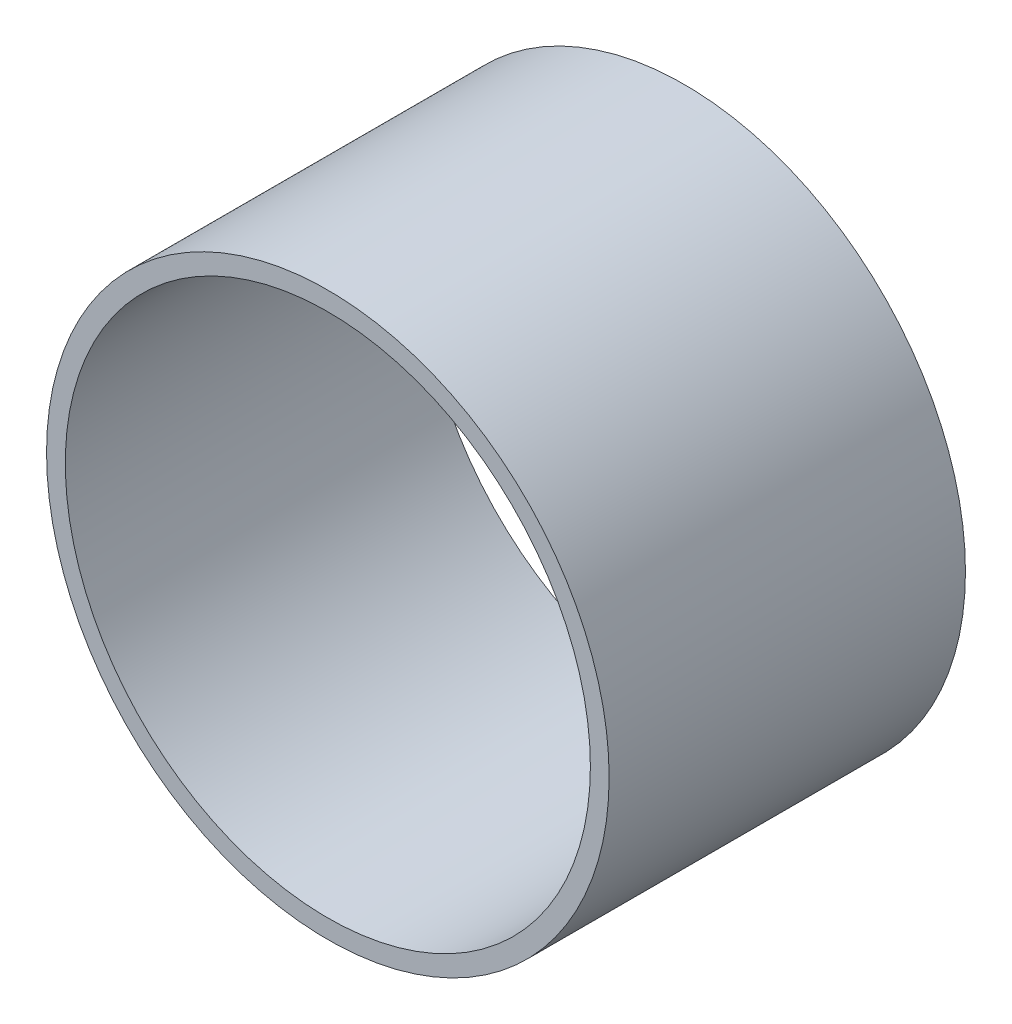
ISO-10303-21;
HEADER;
FILE_DESCRIPTION(('STEP AP214'),'2;1');
FILE_NAME('part.step','',(''),(''),'','','');
FILE_SCHEMA(('AUTOMOTIVE_DESIGN { 1 0 10303 214 1 1 1 1 }'));
ENDSEC;
DATA;
#1=APPLICATION_CONTEXT('core data for automotive mechanical design processes');
#2=APPLICATION_PROTOCOL_DEFINITION('international standard','automotive_design',2000,#1);
#3=PRODUCT_CONTEXT('',#1,'mechanical');
#4=PRODUCT('Part','Part','',(#3));
#5=PRODUCT_RELATED_PRODUCT_CATEGORY('part','',(#4));
#6=PRODUCT_DEFINITION_FORMATION('','',#4);
#7=PRODUCT_DEFINITION_CONTEXT('part definition',#1,'design');
#8=PRODUCT_DEFINITION('design','',#6,#7);
#9=PRODUCT_DEFINITION_SHAPE('','',#8);
#10=(LENGTH_UNIT() NAMED_UNIT(*) SI_UNIT(.MILLI.,.METRE.));
#11=(NAMED_UNIT(*) PLANE_ANGLE_UNIT() SI_UNIT($,.RADIAN.));
#12=(NAMED_UNIT(*) SI_UNIT($,.STERADIAN.) SOLID_ANGLE_UNIT());
#13=UNCERTAINTY_MEASURE_WITH_UNIT(LENGTH_MEASURE(1.E-05),#10,'distance_accuracy_value','');
#14=(GEOMETRIC_REPRESENTATION_CONTEXT(3) GLOBAL_UNCERTAINTY_ASSIGNED_CONTEXT((#13)) GLOBAL_UNIT_ASSIGNED_CONTEXT((#10,
#11,#12)) REPRESENTATION_CONTEXT('',''));
#15=CARTESIAN_POINT('',(0.,0.,0.));
#16=DIRECTION('',(0.,0.,1.));
#17=DIRECTION('',(1.,0.,0.));
#18=AXIS2_PLACEMENT_3D('',#15,#16,#17);
#19=CARTESIAN_POINT('',(0.,0.,9.5));
#20=DIRECTION('',(0.,0.,1.));
#21=DIRECTION('',(1.,0.,0.));
#22=AXIS2_PLACEMENT_3D('',#19,#20,#21);
#23=PLANE('',#22);
#24=CARTESIAN_POINT('',(0.,0.,9.5));
#25=DIRECTION('',(0.,0.,1.));
#26=DIRECTION('',(1.,0.,0.));
#27=AXIS2_PLACEMENT_3D('',#24,#25,#26);
#28=CIRCLE('',#27,7.5);
#29=CARTESIAN_POINT('',(7.5,0.,9.5));
#30=VERTEX_POINT('',#29);
#31=EDGE_CURVE('E10',#30,#30,#28,.T.);
#32=ORIENTED_EDGE('',*,*,#31,.T.);
#33=EDGE_LOOP('',(#32));
#34=FACE_BOUND('',#33,.T.);
#35=CARTESIAN_POINT('',(0.,0.,9.5));
#36=DIRECTION('',(0.,0.,1.));
#37=DIRECTION('',(1.,0.,0.));
#38=AXIS2_PLACEMENT_3D('',#35,#36,#37);
#39=CIRCLE('',#38,7.);
#40=CARTESIAN_POINT('',(7.,0.,9.5));
#41=VERTEX_POINT('',#40);
#42=EDGE_CURVE('E48',#41,#41,#39,.T.);
#43=ORIENTED_EDGE('',*,*,#42,.F.);
#44=EDGE_LOOP('',(#43));
#45=FACE_BOUND('',#44,.T.);
#46=ADVANCED_FACE('F37',(#34,#45),#23,.T.);
#47=CARTESIAN_POINT('',(0.,0.,0.));
#48=DIRECTION('',(0.,0.,1.));
#49=DIRECTION('',(1.,0.,0.));
#50=AXIS2_PLACEMENT_3D('',#47,#48,#49);
#51=PLANE('',#50);
#52=CARTESIAN_POINT('',(0.,0.,0.));
#53=DIRECTION('',(0.,0.,1.));
#54=DIRECTION('',(1.,0.,0.));
#55=AXIS2_PLACEMENT_3D('',#52,#53,#54);
#56=CIRCLE('',#55,7.5);
#57=CARTESIAN_POINT('',(7.5,0.,0.));
#58=VERTEX_POINT('',#57);
#59=EDGE_CURVE('E41',#58,#58,#56,.T.);
#60=ORIENTED_EDGE('',*,*,#59,.F.);
#61=EDGE_LOOP('',(#60));
#62=FACE_BOUND('',#61,.T.);
#63=CARTESIAN_POINT('',(0.,0.,0.));
#64=DIRECTION('',(0.,0.,1.));
#65=DIRECTION('',(1.,0.,0.));
#66=AXIS2_PLACEMENT_3D('',#63,#64,#65);
#67=CIRCLE('',#66,7.);
#68=CARTESIAN_POINT('',(7.,0.,0.));
#69=VERTEX_POINT('',#68);
#70=EDGE_CURVE('E50',#69,#69,#67,.T.);
#71=ORIENTED_EDGE('',*,*,#70,.T.);
#72=EDGE_LOOP('',(#71));
#73=FACE_BOUND('',#72,.T.);
#74=ADVANCED_FACE('F60',(#62,#73),#51,.F.);
#75=CARTESIAN_POINT('',(0.,0.,9.5));
#76=DIRECTION('',(0.,0.,-1.));
#77=DIRECTION('',(-1.,0.,0.));
#78=AXIS2_PLACEMENT_3D('',#75,#76,#77);
#79=CYLINDRICAL_SURFACE('',#78,7.5);
#80=ORIENTED_EDGE('',*,*,#31,.F.);
#81=EDGE_LOOP('',(#80));
#82=FACE_BOUND('',#81,.T.);
#83=ORIENTED_EDGE('',*,*,#59,.T.);
#84=EDGE_LOOP('',(#83));
#85=FACE_BOUND('',#84,.T.);
#86=ADVANCED_FACE('F39',(#82,#85),#79,.T.);
#87=CARTESIAN_POINT('',(0.,0.,9.5));
#88=DIRECTION('',(0.,0.,-1.));
#89=DIRECTION('',(-1.,0.,0.));
#90=AXIS2_PLACEMENT_3D('',#87,#88,#89);
#91=CYLINDRICAL_SURFACE('',#90,7.);
#92=ORIENTED_EDGE('',*,*,#42,.T.);
#93=EDGE_LOOP('',(#92));
#94=FACE_BOUND('',#93,.T.);
#95=ORIENTED_EDGE('',*,*,#70,.F.);
#96=EDGE_LOOP('',(#95));
#97=FACE_BOUND('',#96,.T.);
#98=ADVANCED_FACE('F56',(#94,#97),#91,.F.);
#99=CLOSED_SHELL('',(#46,#74,#86,#98));
#100=MANIFOLD_SOLID_BREP('B2',#99);
#101=ADVANCED_BREP_SHAPE_REPRESENTATION('',(#18,#100),#14);
#102=SHAPE_DEFINITION_REPRESENTATION(#9,#101);
ENDSEC;
END-ISO-10303-21;
